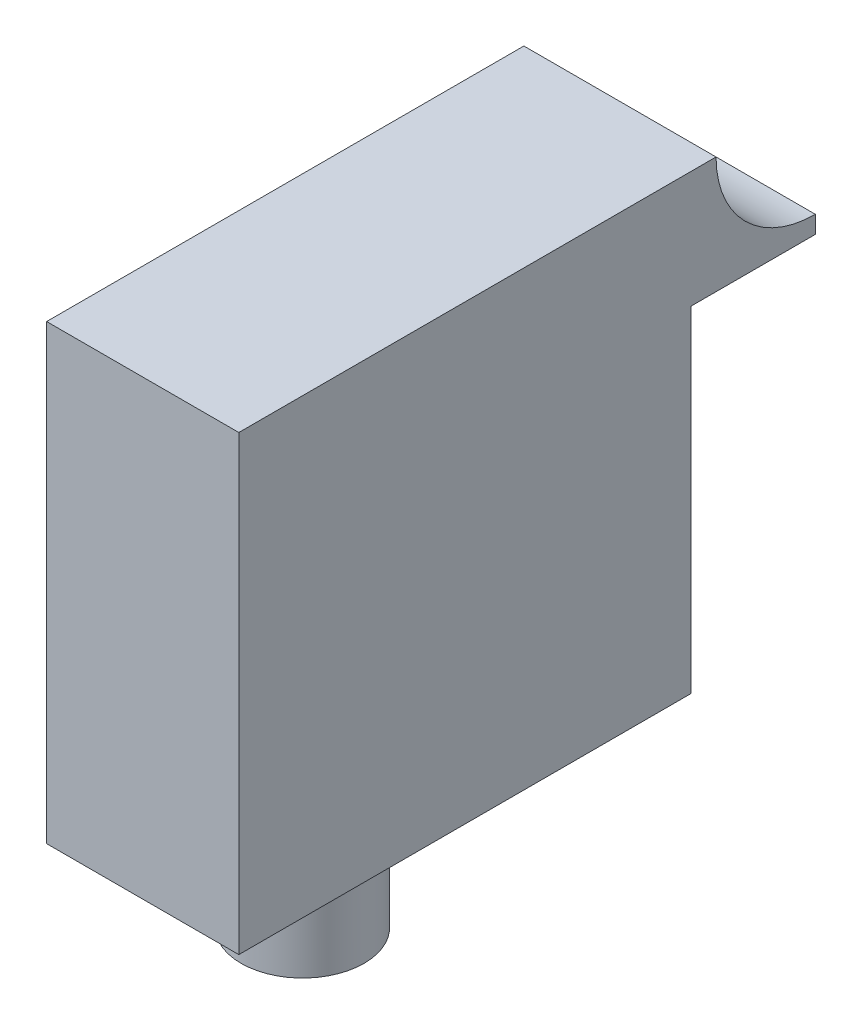
ISO-10303-21;
HEADER;
FILE_DESCRIPTION(('STEP AP214'),'2;1');
FILE_NAME('part.step','',(''),(''),'','','');
FILE_SCHEMA(('AUTOMOTIVE_DESIGN { 1 0 10303 214 1 1 1 1 }'));
ENDSEC;
DATA;
#1=APPLICATION_CONTEXT('core data for automotive mechanical design processes');
#2=APPLICATION_PROTOCOL_DEFINITION('international standard','automotive_design',2000,#1);
#3=PRODUCT_CONTEXT('',#1,'mechanical');
#4=PRODUCT('Part','Part','',(#3));
#5=PRODUCT_RELATED_PRODUCT_CATEGORY('part','',(#4));
#6=PRODUCT_DEFINITION_FORMATION('','',#4);
#7=PRODUCT_DEFINITION_CONTEXT('part definition',#1,'design');
#8=PRODUCT_DEFINITION('design','',#6,#7);
#9=PRODUCT_DEFINITION_SHAPE('','',#8);
#10=(LENGTH_UNIT() NAMED_UNIT(*) SI_UNIT(.MILLI.,.METRE.));
#11=(NAMED_UNIT(*) PLANE_ANGLE_UNIT() SI_UNIT($,.RADIAN.));
#12=(NAMED_UNIT(*) SI_UNIT($,.STERADIAN.) SOLID_ANGLE_UNIT());
#13=UNCERTAINTY_MEASURE_WITH_UNIT(LENGTH_MEASURE(1.E-05),#10,'distance_accuracy_value','');
#14=(GEOMETRIC_REPRESENTATION_CONTEXT(3) GLOBAL_UNCERTAINTY_ASSIGNED_CONTEXT((#13)) GLOBAL_UNIT_ASSIGNED_CONTEXT((#10,
#11,#12)) REPRESENTATION_CONTEXT('',''));
#15=CARTESIAN_POINT('',(0.,0.,0.));
#16=DIRECTION('',(0.,0.,1.));
#17=DIRECTION('',(1.,0.,0.));
#18=AXIS2_PLACEMENT_3D('',#15,#16,#17);
#19=CARTESIAN_POINT('',(7.7671282112135,-31.,5.12832015544973));
#20=DIRECTION('',(0.,1.,0.));
#21=DIRECTION('',(0.,0.,1.));
#22=AXIS2_PLACEMENT_3D('',#19,#20,#21);
#23=CYLINDRICAL_SURFACE('',#22,5.44468189230006);
#24=CARTESIAN_POINT('',(7.7671282112135,-20.,5.12832015544973));
#25=DIRECTION('',(0.,1.,0.));
#26=DIRECTION('',(0.,0.,1.));
#27=AXIS2_PLACEMENT_3D('',#24,#25,#26);
#28=CIRCLE('',#27,5.44468189230006);
#29=CARTESIAN_POINT('',(7.7671282112135,-20.,10.5730020477498));
#30=VERTEX_POINT('',#29);
#31=EDGE_CURVE('E44',#30,#30,#28,.F.);
#32=ORIENTED_EDGE('',*,*,#31,.T.);
#33=EDGE_LOOP('',(#32));
#34=FACE_BOUND('',#33,.T.);
#35=CARTESIAN_POINT('',(7.7671282112135,-30.,5.12832015544973));
#36=DIRECTION('',(0.,-1.,0.));
#37=DIRECTION('',(0.,0.,-1.));
#38=AXIS2_PLACEMENT_3D('',#35,#36,#37);
#39=CIRCLE('',#38,5.44468189230006);
#40=CARTESIAN_POINT('',(7.7671282112135,-30.,-0.316361736850328));
#41=VERTEX_POINT('',#40);
#42=EDGE_CURVE('E39',#41,#41,#39,.T.);
#43=ORIENTED_EDGE('',*,*,#42,.F.);
#44=EDGE_LOOP('',(#43));
#45=FACE_BOUND('',#44,.T.);
#46=ADVANCED_FACE('F35',(#34,#45),#23,.T.);
#47=CARTESIAN_POINT('',(17.,-20.,-20.));
#48=DIRECTION('',(0.,0.,1.));
#49=DIRECTION('',(1.,0.,0.));
#50=AXIS2_PLACEMENT_3D('',#47,#48,#49);
#51=PLANE('',#50);
#52=DIRECTION('',(-1.,0.,0.));
#53=VECTOR('',#52,1.);
#54=CARTESIAN_POINT('',(17.,9.67580424435255,-20.));
#55=LINE('',#54,#53);
#56=CARTESIAN_POINT('',(17.,9.67580424435255,-20.));
#57=VERTEX_POINT('',#56);
#58=CARTESIAN_POINT('',(0.,9.67580424435255,-20.));
#59=VERTEX_POINT('',#58);
#60=EDGE_CURVE('E58',#57,#59,#55,.T.);
#61=ORIENTED_EDGE('',*,*,#60,.F.);
#62=DIRECTION('',(0.,1.,0.));
#63=VECTOR('',#62,1.);
#64=CARTESIAN_POINT('',(17.,-20.,-20.));
#65=LINE('',#64,#63);
#66=CARTESIAN_POINT('',(17.,-20.,-20.));
#67=VERTEX_POINT('',#66);
#68=EDGE_CURVE('E114',#67,#57,#65,.T.);
#69=ORIENTED_EDGE('',*,*,#68,.F.);
#70=DIRECTION('',(-1.,0.,0.));
#71=VECTOR('',#70,1.);
#72=CARTESIAN_POINT('',(17.,-20.,-20.));
#73=LINE('',#72,#71);
#74=CARTESIAN_POINT('',(0.,-20.,-20.));
#75=VERTEX_POINT('',#74);
#76=EDGE_CURVE('E123',#67,#75,#73,.T.);
#77=ORIENTED_EDGE('',*,*,#76,.T.);
#78=DIRECTION('',(0.,1.,0.));
#79=VECTOR('',#78,1.);
#80=CARTESIAN_POINT('',(0.,-20.,-20.));
#81=LINE('',#80,#79);
#82=EDGE_CURVE('E124',#75,#59,#81,.T.);
#83=ORIENTED_EDGE('',*,*,#82,.T.);
#84=EDGE_LOOP('',(#61,#69,#77,#83));
#85=FACE_BOUND('',#84,.T.);
#86=ADVANCED_FACE('F37',(#85),#51,.F.);
#87=CARTESIAN_POINT('',(17.,0.,0.));
#88=DIRECTION('',(-1.,0.,0.));
#89=DIRECTION('',(0.,0.,1.));
#90=AXIS2_PLACEMENT_3D('',#87,#88,#89);
#91=PLANE('',#90);
#92=DIRECTION('',(0.,-1.,0.));
#93=VECTOR('',#92,1.);
#94=CARTESIAN_POINT('',(17.,20.,-31.));
#95=LINE('',#94,#93);
#96=CARTESIAN_POINT('',(17.,11.215584786383,-31.));
#97=VERTEX_POINT('',#96);
#98=CARTESIAN_POINT('',(17.,9.67580424435255,-31.));
#99=VERTEX_POINT('',#98);
#100=EDGE_CURVE('E107',#97,#99,#95,.T.);
#101=ORIENTED_EDGE('',*,*,#100,.F.);
#102=CARTESIAN_POINT('',(17.,20.,-31.));
#103=DIRECTION('',(1.,0.,0.));
#104=DIRECTION('',(0.,0.,-1.));
#105=AXIS2_PLACEMENT_3D('',#102,#103,#104);
#106=CIRCLE('',#105,8.78441521361698);
#107=CARTESIAN_POINT('',(17.,20.,-22.215584786383));
#108=VERTEX_POINT('',#107);
#109=EDGE_CURVE('E50',#108,#97,#106,.T.);
#110=ORIENTED_EDGE('',*,*,#109,.F.);
#111=DIRECTION('',(0.,0.,1.));
#112=VECTOR('',#111,1.);
#113=CARTESIAN_POINT('',(17.,20.,20.));
#114=LINE('',#113,#112);
#115=CARTESIAN_POINT('',(17.,20.,20.));
#116=VERTEX_POINT('',#115);
#117=EDGE_CURVE('E104',#108,#116,#114,.T.);
#118=ORIENTED_EDGE('',*,*,#117,.T.);
#119=DIRECTION('',(0.,-1.,0.));
#120=VECTOR('',#119,1.);
#121=CARTESIAN_POINT('',(17.,-20.,20.));
#122=LINE('',#121,#120);
#123=CARTESIAN_POINT('',(17.,-20.,20.));
#124=VERTEX_POINT('',#123);
#125=EDGE_CURVE('E113',#116,#124,#122,.T.);
#126=ORIENTED_EDGE('',*,*,#125,.T.);
#127=DIRECTION('',(0.,0.,-1.));
#128=VECTOR('',#127,1.);
#129=CARTESIAN_POINT('',(17.,-20.,20.));
#130=LINE('',#129,#128);
#131=EDGE_CURVE('E116',#124,#67,#130,.T.);
#132=ORIENTED_EDGE('',*,*,#131,.T.);
#133=ORIENTED_EDGE('',*,*,#68,.T.);
#134=DIRECTION('',(0.,0.,1.));
#135=VECTOR('',#134,1.);
#136=CARTESIAN_POINT('',(17.,9.67580424435255,-31.));
#137=LINE('',#136,#135);
#138=EDGE_CURVE('E127',#99,#57,#137,.T.);
#139=ORIENTED_EDGE('',*,*,#138,.F.);
#140=EDGE_LOOP('',(#101,#110,#118,#126,#132,#133,#139));
#141=FACE_BOUND('',#140,.T.);
#142=ADVANCED_FACE('F103',(#141),#91,.F.);
#143=CARTESIAN_POINT('',(17.,20.,20.));
#144=DIRECTION('',(0.,-1.,0.));
#145=DIRECTION('',(0.,0.,-1.));
#146=AXIS2_PLACEMENT_3D('',#143,#144,#145);
#147=PLANE('',#146);
#148=ORIENTED_EDGE('',*,*,#117,.F.);
#149=DIRECTION('',(1.,0.,0.));
#150=VECTOR('',#149,1.);
#151=CARTESIAN_POINT('',(-10.,20.,-22.215584786383));
#152=LINE('',#151,#150);
#153=CARTESIAN_POINT('',(0.,20.,-22.215584786383));
#154=VERTEX_POINT('',#153);
#155=EDGE_CURVE('E93',#108,#154,#152,.F.);
#156=ORIENTED_EDGE('',*,*,#155,.T.);
#157=DIRECTION('',(0.,0.,1.));
#158=VECTOR('',#157,1.);
#159=CARTESIAN_POINT('',(0.,20.,20.));
#160=LINE('',#159,#158);
#161=CARTESIAN_POINT('',(0.,20.,20.));
#162=VERTEX_POINT('',#161);
#163=EDGE_CURVE('E126',#154,#162,#160,.T.);
#164=ORIENTED_EDGE('',*,*,#163,.T.);
#165=DIRECTION('',(-1.,0.,0.));
#166=VECTOR('',#165,1.);
#167=CARTESIAN_POINT('',(17.,20.,20.));
#168=LINE('',#167,#166);
#169=EDGE_CURVE('E111',#116,#162,#168,.T.);
#170=ORIENTED_EDGE('',*,*,#169,.F.);
#171=EDGE_LOOP('',(#148,#156,#164,#170));
#172=FACE_BOUND('',#171,.T.);
#173=ADVANCED_FACE('F109',(#172),#147,.F.);
#174=CARTESIAN_POINT('',(17.,-20.,20.));
#175=DIRECTION('',(0.,0.,-1.));
#176=DIRECTION('',(-1.,0.,0.));
#177=AXIS2_PLACEMENT_3D('',#174,#175,#176);
#178=PLANE('',#177);
#179=DIRECTION('',(0.,-1.,0.));
#180=VECTOR('',#179,1.);
#181=CARTESIAN_POINT('',(0.,-20.,20.));
#182=LINE('',#181,#180);
#183=CARTESIAN_POINT('',(0.,-20.,20.));
#184=VERTEX_POINT('',#183);
#185=EDGE_CURVE('E129',#162,#184,#182,.T.);
#186=ORIENTED_EDGE('',*,*,#185,.T.);
#187=DIRECTION('',(-1.,0.,0.));
#188=VECTOR('',#187,1.);
#189=CARTESIAN_POINT('',(17.,-20.,20.));
#190=LINE('',#189,#188);
#191=EDGE_CURVE('E134',#124,#184,#190,.T.);
#192=ORIENTED_EDGE('',*,*,#191,.F.);
#193=ORIENTED_EDGE('',*,*,#125,.F.);
#194=ORIENTED_EDGE('',*,*,#169,.T.);
#195=EDGE_LOOP('',(#186,#192,#193,#194));
#196=FACE_BOUND('',#195,.T.);
#197=ADVANCED_FACE('F147',(#196),#178,.F.);
#198=CARTESIAN_POINT('',(17.,-20.,20.));
#199=DIRECTION('',(0.,1.,0.));
#200=DIRECTION('',(0.,0.,1.));
#201=AXIS2_PLACEMENT_3D('',#198,#199,#200);
#202=PLANE('',#201);
#203=ORIENTED_EDGE('',*,*,#31,.F.);
#204=EDGE_LOOP('',(#203));
#205=FACE_BOUND('',#204,.T.);
#206=DIRECTION('',(0.,0.,-1.));
#207=VECTOR('',#206,1.);
#208=CARTESIAN_POINT('',(0.,-20.,20.));
#209=LINE('',#208,#207);
#210=EDGE_CURVE('E118',#184,#75,#209,.T.);
#211=ORIENTED_EDGE('',*,*,#210,.T.);
#212=ORIENTED_EDGE('',*,*,#76,.F.);
#213=ORIENTED_EDGE('',*,*,#131,.F.);
#214=ORIENTED_EDGE('',*,*,#191,.T.);
#215=EDGE_LOOP('',(#211,#212,#213,#214));
#216=FACE_BOUND('',#215,.T.);
#217=ADVANCED_FACE('F143',(#205,#216),#202,.F.);
#218=CARTESIAN_POINT('',(0.,0.,0.));
#219=DIRECTION('',(-1.,0.,0.));
#220=DIRECTION('',(0.,0.,1.));
#221=AXIS2_PLACEMENT_3D('',#218,#219,#220);
#222=PLANE('',#221);
#223=CARTESIAN_POINT('',(0.,20.,-31.));
#224=DIRECTION('',(-1.,0.,0.));
#225=DIRECTION('',(0.,0.,1.));
#226=AXIS2_PLACEMENT_3D('',#223,#224,#225);
#227=CIRCLE('',#226,8.78441521361698);
#228=CARTESIAN_POINT('',(0.,11.215584786383,-31.));
#229=VERTEX_POINT('',#228);
#230=EDGE_CURVE('E96',#229,#154,#227,.T.);
#231=ORIENTED_EDGE('',*,*,#230,.F.);
#232=DIRECTION('',(0.,1.,0.));
#233=VECTOR('',#232,1.);
#234=CARTESIAN_POINT('',(0.,20.,-31.));
#235=LINE('',#234,#233);
#236=CARTESIAN_POINT('',(0.,9.67580424435255,-31.));
#237=VERTEX_POINT('',#236);
#238=EDGE_CURVE('E161',#237,#229,#235,.T.);
#239=ORIENTED_EDGE('',*,*,#238,.F.);
#240=DIRECTION('',(0.,0.,1.));
#241=VECTOR('',#240,1.);
#242=CARTESIAN_POINT('',(0.,9.67580424435255,-31.));
#243=LINE('',#242,#241);
#244=EDGE_CURVE('E159',#237,#59,#243,.T.);
#245=ORIENTED_EDGE('',*,*,#244,.T.);
#246=ORIENTED_EDGE('',*,*,#82,.F.);
#247=ORIENTED_EDGE('',*,*,#210,.F.);
#248=ORIENTED_EDGE('',*,*,#185,.F.);
#249=ORIENTED_EDGE('',*,*,#163,.F.);
#250=EDGE_LOOP('',(#231,#239,#245,#246,#247,#248,#249));
#251=FACE_BOUND('',#250,.T.);
#252=ADVANCED_FACE('F146',(#251),#222,.T.);
#253=CARTESIAN_POINT('',(17.,9.67580424435255,-31.));
#254=DIRECTION('',(0.,1.,0.));
#255=DIRECTION('',(0.,0.,1.));
#256=AXIS2_PLACEMENT_3D('',#253,#254,#255);
#257=PLANE('',#256);
#258=ORIENTED_EDGE('',*,*,#60,.T.);
#259=ORIENTED_EDGE('',*,*,#244,.F.);
#260=DIRECTION('',(-1.,0.,0.));
#261=VECTOR('',#260,1.);
#262=CARTESIAN_POINT('',(17.,9.67580424435255,-31.));
#263=LINE('',#262,#261);
#264=EDGE_CURVE('E166',#99,#237,#263,.T.);
#265=ORIENTED_EDGE('',*,*,#264,.F.);
#266=ORIENTED_EDGE('',*,*,#138,.T.);
#267=EDGE_LOOP('',(#258,#259,#265,#266));
#268=FACE_BOUND('',#267,.T.);
#269=ADVANCED_FACE('F174',(#268),#257,.F.);
#270=CARTESIAN_POINT('',(0.,0.,-31.));
#271=DIRECTION('',(0.,0.,-1.));
#272=DIRECTION('',(-1.,0.,0.));
#273=AXIS2_PLACEMENT_3D('',#270,#271,#272);
#274=PLANE('',#273);
#275=DIRECTION('',(1.,0.,0.));
#276=VECTOR('',#275,1.);
#277=CARTESIAN_POINT('',(-10.,11.215584786383,-31.));
#278=LINE('',#277,#276);
#279=EDGE_CURVE('E11',#97,#229,#278,.F.);
#280=ORIENTED_EDGE('',*,*,#279,.F.);
#281=ORIENTED_EDGE('',*,*,#100,.T.);
#282=ORIENTED_EDGE('',*,*,#264,.T.);
#283=ORIENTED_EDGE('',*,*,#238,.T.);
#284=EDGE_LOOP('',(#280,#281,#282,#283));
#285=FACE_BOUND('',#284,.T.);
#286=ADVANCED_FACE('F173',(#285),#274,.T.);
#287=CARTESIAN_POINT('',(-10.,20.,-31.));
#288=DIRECTION('',(1.,0.,0.));
#289=DIRECTION('',(0.,0.,-1.));
#290=AXIS2_PLACEMENT_3D('',#287,#288,#289);
#291=CYLINDRICAL_SURFACE('',#290,8.78441521361698);
#292=ORIENTED_EDGE('',*,*,#109,.T.);
#293=ORIENTED_EDGE('',*,*,#279,.T.);
#294=ORIENTED_EDGE('',*,*,#230,.T.);
#295=ORIENTED_EDGE('',*,*,#155,.F.);
#296=EDGE_LOOP('',(#292,#293,#294,#295));
#297=FACE_BOUND('',#296,.T.);
#298=ADVANCED_FACE('F94',(#297),#291,.F.);
#299=CARTESIAN_POINT('',(0.,-30.,0.));
#300=DIRECTION('',(0.,-1.,0.));
#301=DIRECTION('',(0.,0.,-1.));
#302=AXIS2_PLACEMENT_3D('',#299,#300,#301);
#303=PLANE('',#302);
#304=ORIENTED_EDGE('',*,*,#42,.T.);
#305=EDGE_LOOP('',(#304));
#306=FACE_BOUND('',#305,.T.);
#307=ADVANCED_FACE('F202',(#306),#303,.T.);
#308=CLOSED_SHELL('',(#46,#86,#142,#173,#197,#217,#252,#269,#286,#298,#307));
#309=MANIFOLD_SOLID_BREP('B2',#308);
#310=ADVANCED_BREP_SHAPE_REPRESENTATION('',(#18,#309),#14);
#311=SHAPE_DEFINITION_REPRESENTATION(#9,#310);
ENDSEC;
END-ISO-10303-21;
